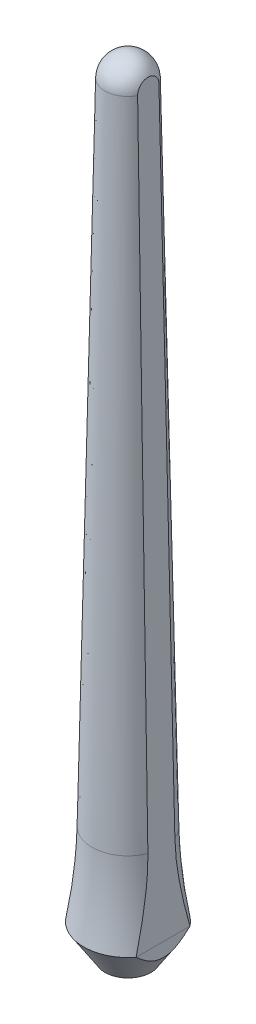
ISO-10303-21;
HEADER;
FILE_DESCRIPTION(('STEP AP214'),'2;1');
FILE_NAME('part.step','',(''),(''),'','','');
FILE_SCHEMA(('AUTOMOTIVE_DESIGN { 1 0 10303 214 1 1 1 1 }'));
ENDSEC;
DATA;
#1=APPLICATION_CONTEXT('core data for automotive mechanical design processes');
#2=APPLICATION_PROTOCOL_DEFINITION('international standard','automotive_design',2000,#1);
#3=PRODUCT_CONTEXT('',#1,'mechanical');
#4=PRODUCT('Part','Part','',(#3));
#5=PRODUCT_RELATED_PRODUCT_CATEGORY('part','',(#4));
#6=PRODUCT_DEFINITION_FORMATION('','',#4);
#7=PRODUCT_DEFINITION_CONTEXT('part definition',#1,'design');
#8=PRODUCT_DEFINITION('design','',#6,#7);
#9=PRODUCT_DEFINITION_SHAPE('','',#8);
#10=(LENGTH_UNIT() NAMED_UNIT(*) SI_UNIT(.MILLI.,.METRE.));
#11=(NAMED_UNIT(*) PLANE_ANGLE_UNIT() SI_UNIT($,.RADIAN.));
#12=(NAMED_UNIT(*) SI_UNIT($,.STERADIAN.) SOLID_ANGLE_UNIT());
#13=UNCERTAINTY_MEASURE_WITH_UNIT(LENGTH_MEASURE(1.E-05),#10,'distance_accuracy_value','');
#14=(GEOMETRIC_REPRESENTATION_CONTEXT(3) GLOBAL_UNCERTAINTY_ASSIGNED_CONTEXT((#13)) GLOBAL_UNIT_ASSIGNED_CONTEXT((#10,
#11,#12)) REPRESENTATION_CONTEXT('',''));
#15=CARTESIAN_POINT('',(0.,0.,0.));
#16=DIRECTION('',(0.,0.,1.));
#17=DIRECTION('',(1.,0.,0.));
#18=AXIS2_PLACEMENT_3D('',#15,#16,#17);
#19=CARTESIAN_POINT('',(0.,5.00000000000002,0.));
#20=DIRECTION('',(0.,-1.,0.));
#21=DIRECTION('',(0.,0.,-1.));
#22=AXIS2_PLACEMENT_3D('',#19,#20,#21);
#23=PLANE('',#22);
#24=CARTESIAN_POINT('',(0.,5.00000000000002,0.));
#25=DIRECTION('',(0.,-1.,0.));
#26=DIRECTION('',(0.,0.,-1.));
#27=AXIS2_PLACEMENT_3D('',#24,#25,#26);
#28=CIRCLE('',#27,2.2);
#29=CARTESIAN_POINT('',(0.,5.00000000000002,-2.2));
#30=VERTEX_POINT('',#29);
#31=EDGE_CURVE('E89',#30,#30,#28,.F.);
#32=ORIENTED_EDGE('',*,*,#31,.T.);
#33=EDGE_LOOP('',(#32));
#34=FACE_BOUND('',#33,.T.);
#35=DIRECTION('',(0.,0.,1.));
#36=VECTOR('',#35,1.);
#37=CARTESIAN_POINT('',(5.35367568229556,5.00000000000003,-10.));
#38=LINE('',#37,#36);
#39=CARTESIAN_POINT('',(5.35367568229556,5.00000000000002,-4.11104082791655));
#40=VERTEX_POINT('',#39);
#41=CARTESIAN_POINT('',(5.35367568229556,5.00000000000002,4.11104082791656));
#42=VERTEX_POINT('',#41);
#43=EDGE_CURVE('E88',#40,#42,#38,.T.);
#44=ORIENTED_EDGE('',*,*,#43,.T.);
#45=CARTESIAN_POINT('',(0.,5.00000000000002,0.));
#46=DIRECTION('',(0.,1.,0.));
#47=DIRECTION('',(0.,0.,1.));
#48=AXIS2_PLACEMENT_3D('',#45,#46,#47);
#49=CIRCLE('',#48,6.74999999999998);
#50=EDGE_CURVE('E59',#40,#42,#49,.T.);
#51=ORIENTED_EDGE('',*,*,#50,.F.);
#52=EDGE_LOOP('',(#44,#51));
#53=FACE_BOUND('',#52,.T.);
#54=ADVANCED_FACE('F45',(#34,#53),#23,.T.);
#55=CARTESIAN_POINT('',(0.,116.499285975242,0.));
#56=DIRECTION('',(0.,1.,0.));
#57=DIRECTION('',(1.,0.,0.));
#58=AXIS2_PLACEMENT_3D('',#55,#56,#57);
#59=SPHERICAL_SURFACE('',#58,3.5007140247583);
#60=CARTESIAN_POINT('',(0.,116.569987341137,0.));
#61=DIRECTION('',(0.,1.,0.));
#62=DIRECTION('',(0.,0.,1.));
#63=AXIS2_PLACEMENT_3D('',#60,#61,#62);
#64=CIRCLE('',#63,3.5);
#65=CARTESIAN_POINT('',(3.09991839717048,116.569987341137,-1.62496336293592));
#66=VERTEX_POINT('',#65);
#67=CARTESIAN_POINT('',(3.09991839717048,116.569987341137,1.62496336293592));
#68=VERTEX_POINT('',#67);
#69=EDGE_CURVE('E145',#66,#68,#64,.T.);
#70=ORIENTED_EDGE('',*,*,#69,.T.);
#71=CARTESIAN_POINT('',(3.10008158618536,116.561908833107,0.));
#72=DIRECTION('',(-0.999796034536597,-0.0201962700738357,0.));
#73=DIRECTION('',(0.0201962700738357,-0.999796034536597,0.));
#74=AXIS2_PLACEMENT_3D('',#71,#72,#73);
#75=CIRCLE('',#74,1.62498345216394);
#76=EDGE_CURVE('E85',#68,#66,#75,.T.);
#77=ORIENTED_EDGE('',*,*,#76,.T.);
#78=EDGE_LOOP('',(#70,#77));
#79=FACE_BOUND('',#78,.T.);
#80=ADVANCED_FACE('F132',(#79),#59,.T.);
#81=CARTESIAN_POINT('',(0.,17.5619991451545,0.));
#82=DIRECTION('',(0.,-1.,0.));
#83=DIRECTION('',(0.,0.,-1.));
#84=AXIS2_PLACEMENT_3D('',#81,#82,#83);
#85=CONICAL_SURFACE('',#84,5.5,0.0201976432997341);
#86=ORIENTED_EDGE('',*,*,#69,.F.);
#87=CARTESIAN_POINT('',(3.09991435709243,116.570187341137,-1.62496236822955));
#88=CARTESIAN_POINT('',(3.14610546242772,114.283543135239,-1.63633393036813));
#89=CARTESIAN_POINT('',(3.19229657957681,111.996898344511,-1.6475877493091));
#90=CARTESIAN_POINT('',(3.42325222342207,100.563671514697,-1.70329716735332));
#91=CARTESIAN_POINT('',(3.60801691597004,91.4170812652855,-1.74607373438255));
#92=CARTESIAN_POINT('',(4.0106382231318,71.4857184518239,-1.83619547812997));
#93=CARTESIAN_POINT('',(4.22849488788081,60.700943405881,-1.88298674040131));
#94=CARTESIAN_POINT('',(4.66420848322755,39.1313801534215,-1.9733702488432));
#95=CARTESIAN_POINT('',(4.88206541382528,28.3465919469052,-2.01696249509556));
#96=CARTESIAN_POINT('',(5.09992243724853,17.5617991451546,-2.05932891372988));
#97=B_SPLINE_CURVE_WITH_KNOTS('',3,(#87,#88,#89,#90,#91,#92,#93,#94,#95,#96),.UNSPECIFIED.,.F.,
.F.,(4,2,2,2,4),(0.,6.86141690018943,34.3070849192268,66.6683145201144,99.0295432934016),.UNSPECIFIED.);
#98=CARTESIAN_POINT('',(5.09991839717052,17.5619991451525,-2.05932812883293));
#99=VERTEX_POINT('',#98);
#100=EDGE_CURVE('E117',#66,#99,#97,.T.);
#101=ORIENTED_EDGE('',*,*,#100,.T.);
#102=CARTESIAN_POINT('',(0.,17.5619991451545,0.));
#103=DIRECTION('',(0.,1.,0.));
#104=DIRECTION('',(0.,0.,1.));
#105=AXIS2_PLACEMENT_3D('',#102,#103,#104);
#106=CIRCLE('',#105,5.5);
#107=CARTESIAN_POINT('',(5.09991839717048,17.5619991451545,2.05932812883278));
#108=VERTEX_POINT('',#107);
#109=EDGE_CURVE('E86',#99,#108,#106,.T.);
#110=ORIENTED_EDGE('',*,*,#109,.T.);
#111=CARTESIAN_POINT('',(5.09992243724853,17.5617991451545,2.05932891372988));
#112=CARTESIAN_POINT('',(5.0273359396284,21.1551206949352,2.04522414430223));
#113=CARTESIAN_POINT('',(4.95474945274636,24.7484417131377,2.03097838742701));
#114=CARTESIAN_POINT('',(4.59181707437437,42.7150440300346,1.95898343876524));
#115=CARTESIAN_POINT('',(4.30147136568499,57.0883162793709,1.89893575695234));
#116=CARTESIAN_POINT('',(3.85925716155159,78.9796856308383,1.80255164707141));
#117=CARTESIAN_POINT('',(3.70738845712159,86.4977930786105,1.76856544396031));
#118=CARTESIAN_POINT('',(3.4036512465835,101.533998156429,1.69845717388399));
#119=CARTESIAN_POINT('',(3.25178274047541,109.052095786474,1.66233510687496));
#120=CARTESIAN_POINT('',(3.09991435709243,116.570187341137,1.62496236822955));
#121=B_SPLINE_CURVE_WITH_KNOTS('',3,(#111,#112,#113,#114,#115,#116,#117,#118,#119,#120),
.UNSPECIFIED.,.F.,.F.,(4,2,2,2,4),(0.,10.7822469186976,53.9112353206532,76.4703890501444,
99.0295432424881),.UNSPECIFIED.);
#122=EDGE_CURVE('E67',#108,#68,#121,.T.);
#123=ORIENTED_EDGE('',*,*,#122,.T.);
#124=EDGE_LOOP('',(#86,#101,#110,#123));
#125=FACE_BOUND('',#124,.T.);
#126=ADVANCED_FACE('F128',(#125),#85,.T.);
#127=CARTESIAN_POINT('',(0.,19.1777007510614,0.));
#128=DIRECTION('',(0.,1.,0.));
#129=DIRECTION('',(0.,0.,1.));
#130=AXIS2_PLACEMENT_3D('',#127,#128,#129);
#131=TOROIDAL_SURFACE('',#130,85.4836827629278,80.);
#132=ORIENTED_EDGE('',*,*,#109,.F.);
#133=CARTESIAN_POINT('',(5.09991435709243,17.5621991451545,-2.05932734460359));
#134=CARTESIAN_POINT('',(5.10452896629076,17.3337575586357,-2.06020698915133));
#135=CARTESIAN_POINT('',(5.10914319828198,17.1053346453757,-2.06373293590793));
#136=CARTESIAN_POINT('',(5.1183686047149,16.6486401797689,-2.07596787817014));
#137=CARTESIAN_POINT('',(5.12297977931522,16.4203686195699,-2.08467657960226));
#138=CARTESIAN_POINT('',(5.13680021706112,15.736201750965,-2.1183988822322));
#139=CARTESIAN_POINT('',(5.14600223754393,15.2806649832946,-2.1510100753998));
#140=CARTESIAN_POINT('',(5.16435190555463,14.3722831263924,-2.23428560069819));
#141=CARTESIAN_POINT('',(5.17349962746221,13.9194343550698,-2.28491095042669));
#142=CARTESIAN_POINT('',(5.19175606191117,13.0156679318581,-2.40150902285611));
#143=CARTESIAN_POINT('',(5.20086476791155,12.5647506037749,-2.46748422371461));
#144=CARTESIAN_POINT('',(5.21899607631099,11.6671784197801,-2.61183471041757));
#145=CARTESIAN_POINT('',(5.22801888201827,11.2205134992999,-2.69014811399502));
#146=CARTESIAN_POINT('',(5.24602403975343,10.3291862770449,-2.85729260397339));
#147=CARTESIAN_POINT('',(5.25500639326848,9.8845239016496,-2.94612330039143));
#148=CARTESIAN_POINT('',(5.27293689162516,8.99689261682651,-3.13274433737403));
#149=CARTESIAN_POINT('',(5.28188502006178,8.55392451951234,-3.2305385214563));
#150=CARTESIAN_POINT('',(5.29974517507242,7.66977551127606,-3.43389413009461));
#151=CARTESIAN_POINT('',(5.30865720153345,7.22859460594814,-3.5394555789435));
#152=CARTESIAN_POINT('',(5.32056926750203,6.63889976254498,-3.68548769992811));
#153=CARTESIAN_POINT('',(5.32358482232377,6.48961775444731,-3.72288094197163));
#154=CARTESIAN_POINT('',(5.32961157812885,6.19126927064266,-3.79844108564974));
#155=CARTESIAN_POINT('',(5.33262277961424,6.0422027700816,-3.83660788891452));
#156=CARTESIAN_POINT('',(5.33864371058579,5.74414263880186,-3.91372895820277));
#157=CARTESIAN_POINT('',(5.34165343681504,5.59514916931262,-3.95268384711777));
#158=CARTESIAN_POINT('',(5.34766933650974,5.29733810633174,-4.03133725860596));
#159=CARTESIAN_POINT('',(5.3506755094701,5.1485205378449,-4.07103587590277));
#160=CARTESIAN_POINT('',(5.35367972237361,4.99980000000003,-4.11109469951994));
#161=B_SPLINE_CURVE_WITH_KNOTS('',3,(#133,#134,#135,#136,#137,#138,#139,#140,#141,#142,#143,
#144,#145,#146,#147,#148,#149,#150,#151,#152,#153,#154,#155,#156,#157,#158,#159,#160),
.UNSPECIFIED.,.F.,.F.,(4,2,2,2,2,2,2,2,2,2,2,2,2,4),(0.,0.685438783844462,1.37083867907211,
2.74077127796213,4.10775721095033,5.47496399038895,6.83551990243582,8.19602538064549,
9.55711699356034,10.9182128635994,11.3799824091508,11.8416935977678,12.3037851959859,
12.765936053254),.UNSPECIFIED.);
#162=EDGE_CURVE('E84',#99,#40,#161,.T.);
#163=ORIENTED_EDGE('',*,*,#162,.T.);
#164=ORIENTED_EDGE('',*,*,#50,.T.);
#165=CARTESIAN_POINT('',(5.35367972237361,4.99980000000002,4.1110946995199));
#166=CARTESIAN_POINT('',(5.34480768219585,5.43900142459723,3.99283466106684));
#167=CARTESIAN_POINT('',(5.33591873296906,5.87903991465762,3.87764368570681));
#168=CARTESIAN_POINT('',(5.31810505406893,6.76088816979317,3.65405688658514));
#169=CARTESIAN_POINT('',(5.30918032062148,7.20269812170189,3.54566180076353));
#170=CARTESIAN_POINT('',(5.29126749895949,8.08945433953556,3.33602749218125));
#171=CARTESIAN_POINT('',(5.2822793002837,8.53440607373342,3.23481133044022));
#172=CARTESIAN_POINT('',(5.26426531115392,9.42617048529515,3.04096485297671));
#173=CARTESIAN_POINT('',(5.25523952172136,9.87298311209443,2.94833430553399));
#174=CARTESIAN_POINT('',(5.23724064492169,10.7639994029556,2.77401650097064));
#175=CARTESIAN_POINT('',(5.22826796441692,11.2081829257071,2.69222689012234));
#176=CARTESIAN_POINT('',(5.21028137942427,12.0985907230261,2.54039656869691));
#177=CARTESIAN_POINT('',(5.20126747328878,12.5448150791572,2.47035633198488));
#178=CARTESIAN_POINT('',(5.18321025742967,13.4387193864727,2.34449625335994));
#179=CARTESIAN_POINT('',(5.17416699860283,13.8863968180633,2.28865872969257));
#180=CARTESIAN_POINT('',(5.1560452473302,14.783495886109,2.19375806830287));
#181=CARTESIAN_POINT('',(5.14696676055255,15.2329172419685,2.15469233644614));
#182=CARTESIAN_POINT('',(5.13156251597715,15.9954888745131,2.10469295216028));
#183=CARTESIAN_POINT('',(5.12524328865481,16.3083158665817,2.08881067171678));
#184=CARTESIAN_POINT('',(5.11575413049453,16.7780670961433,2.07225513162622));
#185=CARTESIAN_POINT('',(5.11258668703296,16.9348681985708,2.06794737471449));
#186=CARTESIAN_POINT('',(5.1062509947377,17.2485102725616,2.06178898987371));
#187=CARTESIAN_POINT('',(5.10308274595549,17.4053512415772,2.05993823198454));
#188=CARTESIAN_POINT('',(5.09991435709243,17.5621991451545,2.0593273446036));
#189=B_SPLINE_CURVE_WITH_KNOTS('',3,(#165,#166,#167,#168,#169,#170,#171,#172,#173,#174,#175,
#176,#177,#178,#179,#180,#181,#182,#183,#184,#185,#186,#187,#188),.UNSPECIFIED.,.F.,.F.,(4,2,2,
2,2,2,2,2,2,2,2,4),(0.,1.36479693473999,2.72974181187477,4.09888944252287,5.46800010998594,
6.82308995642522,8.17823444198564,9.53168348224648,10.8849231057195,11.824655186397,
12.2953144474091,12.7659488124545),.UNSPECIFIED.);
#190=EDGE_CURVE('E82',#42,#108,#189,.T.);
#191=ORIENTED_EDGE('',*,*,#190,.T.);
#192=EDGE_LOOP('',(#132,#163,#164,#191));
#193=FACE_BOUND('',#192,.T.);
#194=ADVANCED_FACE('F81',(#193),#131,.F.);
#195=CARTESIAN_POINT('',(2.82862690032118,130.,-10.));
#196=DIRECTION('',(-0.999796034536597,-0.0201962700738357,0.));
#197=DIRECTION('',(0.0201962700738357,-0.999796034536597,0.));
#198=AXIS2_PLACEMENT_3D('',#195,#196,#197);
#199=PLANE('',#198);
#200=ORIENTED_EDGE('',*,*,#43,.F.);
#201=ORIENTED_EDGE('',*,*,#162,.F.);
#202=ORIENTED_EDGE('',*,*,#100,.F.);
#203=ORIENTED_EDGE('',*,*,#76,.F.);
#204=ORIENTED_EDGE('',*,*,#122,.F.);
#205=ORIENTED_EDGE('',*,*,#190,.F.);
#206=EDGE_LOOP('',(#200,#201,#202,#203,#204,#205));
#207=FACE_BOUND('',#206,.T.);
#208=ADVANCED_FACE('F91',(#207),#199,.F.);
#209=CARTESIAN_POINT('',(0.,12.,0.));
#210=DIRECTION('',(0.,-1.,0.));
#211=DIRECTION('',(0.,0.,-1.));
#212=AXIS2_PLACEMENT_3D('',#209,#210,#211);
#213=CYLINDRICAL_SURFACE('',#212,2.2);
#214=CARTESIAN_POINT('',(0.,11.5,0.));
#215=DIRECTION('',(0.,-1.,0.));
#216=DIRECTION('',(0.,0.,-1.));
#217=AXIS2_PLACEMENT_3D('',#214,#215,#216);
#218=CIRCLE('',#217,2.2);
#219=CARTESIAN_POINT('',(0.,11.5,-2.2));
#220=VERTEX_POINT('',#219);
#221=EDGE_CURVE('E12',#220,#220,#218,.F.);
#222=ORIENTED_EDGE('',*,*,#221,.T.);
#223=EDGE_LOOP('',(#222));
#224=FACE_BOUND('',#223,.T.);
#225=ORIENTED_EDGE('',*,*,#31,.F.);
#226=EDGE_LOOP('',(#225));
#227=FACE_BOUND('',#226,.T.);
#228=ADVANCED_FACE('F113',(#224,#227),#213,.F.);
#229=CARTESIAN_POINT('',(0.,12.,0.));
#230=DIRECTION('',(0.,-1.,0.));
#231=DIRECTION('',(0.,0.,-1.));
#232=AXIS2_PLACEMENT_3D('',#229,#230,#231);
#233=PLANE('',#232);
#234=CARTESIAN_POINT('',(0.,12.,0.));
#235=DIRECTION('',(0.,-1.,0.));
#236=DIRECTION('',(0.,0.,-1.));
#237=AXIS2_PLACEMENT_3D('',#234,#235,#236);
#238=CIRCLE('',#237,1.70000000000001);
#239=CARTESIAN_POINT('',(0.,12.,-1.70000000000001));
#240=VERTEX_POINT('',#239);
#241=EDGE_CURVE('E53',#240,#240,#238,.T.);
#242=ORIENTED_EDGE('',*,*,#241,.T.);
#243=EDGE_LOOP('',(#242));
#244=FACE_BOUND('',#243,.T.);
#245=ADVANCED_FACE('F141',(#244),#233,.T.);
#246=CARTESIAN_POINT('',(0.,12.,0.));
#247=DIRECTION('',(0.,-1.,0.));
#248=DIRECTION('',(0.,0.,-1.));
#249=AXIS2_PLACEMENT_3D('',#246,#247,#248);
#250=CONICAL_SURFACE('',#249,1.70000000000001,0.785398163397458);
#251=ORIENTED_EDGE('',*,*,#221,.F.);
#252=EDGE_LOOP('',(#251));
#253=FACE_BOUND('',#252,.T.);
#254=ORIENTED_EDGE('',*,*,#241,.F.);
#255=EDGE_LOOP('',(#254));
#256=FACE_BOUND('',#255,.T.);
#257=ADVANCED_FACE('F47',(#253,#256),#250,.F.);
#258=CLOSED_SHELL('',(#54,#80,#126,#194,#208,#228,#245,#257));
#259=MANIFOLD_SOLID_BREP('B2',#258);
#260=CARTESIAN_POINT('',(0.,5.00000000000002,0.));
#261=DIRECTION('',(0.,-1.,0.));
#262=DIRECTION('',(0.,0.,-1.));
#263=AXIS2_PLACEMENT_3D('',#260,#261,#262);
#264=PLANE('',#263);
#265=DIRECTION('',(0.,0.,1.));
#266=VECTOR('',#265,1.);
#267=CARTESIAN_POINT('',(5.35367568229556,5.00000000000003,-10.));
#268=LINE('',#267,#266);
#269=CARTESIAN_POINT('',(5.35367568229556,5.00000000000002,-4.11104082791655));
#270=VERTEX_POINT('',#269);
#271=CARTESIAN_POINT('',(5.35367568229556,5.00000000000002,4.11104082791656));
#272=VERTEX_POINT('',#271);
#273=EDGE_CURVE('E229',#270,#272,#268,.T.);
#274=ORIENTED_EDGE('',*,*,#273,.F.);
#275=CARTESIAN_POINT('',(0.,5.00000000000002,0.));
#276=DIRECTION('',(0.,1.,0.));
#277=DIRECTION('',(0.,0.,1.));
#278=AXIS2_PLACEMENT_3D('',#275,#276,#277);
#279=CIRCLE('',#278,6.74999999999998);
#280=EDGE_CURVE('E43',#270,#272,#279,.T.);
#281=ORIENTED_EDGE('',*,*,#280,.T.);
#282=EDGE_LOOP('',(#274,#281));
#283=FACE_BOUND('',#282,.T.);
#284=CARTESIAN_POINT('',(0.,5.00000000000002,0.));
#285=DIRECTION('',(0.,-1.,0.));
#286=DIRECTION('',(0.,0.,-1.));
#287=AXIS2_PLACEMENT_3D('',#284,#285,#286);
#288=CIRCLE('',#287,2.2);
#289=CARTESIAN_POINT('',(0.,5.00000000000002,-2.2));
#290=VERTEX_POINT('',#289);
#291=EDGE_CURVE('E215',#290,#290,#288,.F.);
#292=ORIENTED_EDGE('',*,*,#291,.F.);
#293=EDGE_LOOP('',(#292));
#294=FACE_BOUND('',#293,.T.);
#295=ADVANCED_FACE('F212',(#283,#294),#264,.F.);
#296=CARTESIAN_POINT('',(3.5,0.,0.));
#297=DIRECTION('',(0.,1.,0.));
#298=DIRECTION('',(0.,0.,1.));
#299=AXIS2_PLACEMENT_3D('',#296,#297,#298);
#300=PLANE('',#299);
#301=CARTESIAN_POINT('',(0.,0.,0.));
#302=DIRECTION('',(0.,1.,0.));
#303=DIRECTION('',(0.,0.,1.));
#304=AXIS2_PLACEMENT_3D('',#301,#302,#303);
#305=CIRCLE('',#304,2.40000000000004);
#306=CARTESIAN_POINT('',(0.,0.,2.40000000000004));
#307=VERTEX_POINT('',#306);
#308=EDGE_CURVE('E234',#307,#307,#305,.T.);
#309=ORIENTED_EDGE('',*,*,#308,.T.);
#310=EDGE_LOOP('',(#309));
#311=FACE_BOUND('',#310,.T.);
#312=CARTESIAN_POINT('',(0.,0.,0.));
#313=DIRECTION('',(0.,1.,0.));
#314=DIRECTION('',(0.,0.,1.));
#315=AXIS2_PLACEMENT_3D('',#312,#313,#314);
#316=CIRCLE('',#315,3.5);
#317=CARTESIAN_POINT('',(0.,0.,3.5));
#318=VERTEX_POINT('',#317);
#319=EDGE_CURVE('E238',#318,#318,#316,.T.);
#320=ORIENTED_EDGE('',*,*,#319,.F.);
#321=EDGE_LOOP('',(#320));
#322=FACE_BOUND('',#321,.T.);
#323=ADVANCED_FACE('F267',(#311,#322),#300,.F.);
#324=CARTESIAN_POINT('',(0.,0.,0.));
#325=DIRECTION('',(0.,1.,0.));
#326=DIRECTION('',(0.,0.,1.));
#327=AXIS2_PLACEMENT_3D('',#324,#325,#326);
#328=CONICAL_SURFACE('',#327,3.5,0.576375220591178);
#329=ORIENTED_EDGE('',*,*,#280,.F.);
#330=CARTESIAN_POINT('',(5.35367164221751,5.00020000000003,-4.11125953501063));
#331=CARTESIAN_POINT('',(5.35511692423103,4.92865276773287,-4.03301479306865));
#332=CARTESIAN_POINT('',(5.35654779961362,4.8578187212381,-3.95411897956354));
#333=CARTESIAN_POINT('',(5.35937664825315,4.7177794148828,-3.7948686918183));
#334=CARTESIAN_POINT('',(5.36077461517961,4.64857446840616,-3.71451394210966));
#335=CARTESIAN_POINT('',(5.36492255015165,4.44323512003153,-3.47046241528216));
#336=CARTESIAN_POINT('',(5.36761563461441,4.30991668268151,-3.30436365374862));
#337=CARTESIAN_POINT('',(5.37287192877134,4.04970912775949,-2.95984040312821));
#338=CARTESIAN_POINT('',(5.37542945411824,3.92310140808097,-2.78120170956469));
#339=CARTESIAN_POINT('',(5.38024974466432,3.68447777333756,-2.41462674941403));
#340=CARTESIAN_POINT('',(5.38251297976906,3.57243859607004,-2.22670598289944));
#341=CARTESIAN_POINT('',(5.38569532706075,3.41489969452454,-1.9284168119956));
#342=CARTESIAN_POINT('',(5.38675670809534,3.3623570940522,-1.82176564613117));
#343=CARTESIAN_POINT('',(5.38873750908259,3.26429953367015,-1.60523944894286));
#344=CARTESIAN_POINT('',(5.38965692042145,3.21878500017788,-1.49536422248486));
#345=CARTESIAN_POINT('',(5.39132311012174,3.13630195508868,-1.27326793542692));
#346=CARTESIAN_POINT('',(5.39207101239074,3.09927780557818,-1.16106772796145));
#347=CARTESIAN_POINT('',(5.39337675164893,3.0346384970468,-0.933994915400003));
#348=CARTESIAN_POINT('',(5.39393464511277,3.00702054230585,-0.819123115220893));
#349=CARTESIAN_POINT('',(5.3948451788186,2.9619454871063,-0.585472377297035));
#350=CARTESIAN_POINT('',(5.39519440203568,2.94465754302941,-0.466660342963415));
#351=CARTESIAN_POINT('',(5.39565662828406,2.92177549755743,-0.227909800306506));
#352=CARTESIAN_POINT('',(5.39576965060529,2.91618044123434,-0.107971384775526));
#353=CARTESIAN_POINT('',(5.39575363982904,2.91697303860713,0.131874023397841));
#354=CARTESIAN_POINT('',(5.39562459078746,2.92336148160024,0.251781013450118));
#355=CARTESIAN_POINT('',(5.39513111754964,2.94779037785241,0.49039644031121));
#356=CARTESIAN_POINT('',(5.39476666510787,2.96583222937898,0.609104731554516));
#357=CARTESIAN_POINT('',(5.39377312108013,3.01501662706443,0.855929306449793));
#358=CARTESIAN_POINT('',(5.39312151481753,3.04727373964209,0.983821718109006));
#359=CARTESIAN_POINT('',(5.39158717285173,3.1232297952616,1.23617294938953));
#360=CARTESIAN_POINT('',(5.390704329783,3.16693405332554,1.36063014425583));
#361=CARTESIAN_POINT('',(5.38873503926084,3.26442179971148,1.60662684087154));
#362=CARTESIAN_POINT('',(5.38764704125782,3.31828204643188,1.72813559823649));
#363=CARTESIAN_POINT('',(5.38530594647016,3.43417558898288,1.96713502070341));
#364=CARTESIAN_POINT('',(5.38405286148488,3.49620830069847,2.08462597221697));
#365=CARTESIAN_POINT('',(5.38071758169192,3.66131797188456,2.37644679977846));
#366=CARTESIAN_POINT('',(5.37854537377503,3.76885093978185,2.54824898215406));
#367=CARTESIAN_POINT('',(5.37396576318337,3.99555995548238,2.88410876999277));
#368=CARTESIAN_POINT('',(5.37155811957569,4.11474793042681,3.04815818163453));
#369=CARTESIAN_POINT('',(5.36663520556251,4.35845183668058,3.36516955677594));
#370=CARTESIAN_POINT('',(5.36412463643611,4.48273503589631,3.51831166090924));
#371=CARTESIAN_POINT('',(5.36026655123287,4.67372566302697,3.74377788107529));
#372=CARTESIAN_POINT('',(5.35896688509255,4.73806432796687,3.81813235761211));
#373=CARTESIAN_POINT('',(5.35633949165318,4.86813079728223,3.96559785143201));
#374=CARTESIAN_POINT('',(5.35501176835379,4.93385840365894,4.03870904330379));
#375=CARTESIAN_POINT('',(5.35367164221751,5.00020000000002,4.11125953501062));
#376=B_SPLINE_CURVE_WITH_KNOTS('',3,(#330,#331,#332,#333,#334,#335,#336,#337,#338,#339,#340,
#341,#342,#343,#344,#345,#346,#347,#348,#349,#350,#351,#352,#353,#354,#355,#356,#357,#358,#359,
#360,#361,#362,#363,#364,#365,#366,#367,#368,#369,#370,#371,#372,#373,#374,#375),.UNSPECIFIED.,
.F.,.F.,(4,2,2,2,2,2,2,2,2,2,2,2,2,2,2,2,2,2,2,2,2,2,4),(0.,0.318094523005165,0.636249744729262,
1.27494844693423,1.93138584890341,2.58676187053905,2.943247155499,3.2997540611783,
3.65385337560378,4.00784735218734,4.3674896062327,4.72710248807435,5.08673905677158,
5.44641878550784,5.84149662563462,6.23675823047004,6.63513651104889,7.03348633355318,
7.64087807518887,8.24889802826971,8.8403988057229,9.135389781723,9.43033898562389),.UNSPECIFIED.);
#377=EDGE_CURVE('E233',#270,#272,#376,.T.);
#378=ORIENTED_EDGE('',*,*,#377,.T.);
#379=EDGE_LOOP('',(#329,#378));
#380=FACE_BOUND('',#379,.T.);
#381=ORIENTED_EDGE('',*,*,#319,.T.);
#382=EDGE_LOOP('',(#381));
#383=FACE_BOUND('',#382,.T.);
#384=ADVANCED_FACE('F235',(#380,#383),#328,.T.);
#385=CARTESIAN_POINT('',(2.82862690032118,130.,-10.));
#386=DIRECTION('',(-0.999796034536597,-0.0201962700738357,0.));
#387=DIRECTION('',(0.0201962700738357,-0.999796034536597,0.));
#388=AXIS2_PLACEMENT_3D('',#385,#386,#387);
#389=PLANE('',#388);
#390=ORIENTED_EDGE('',*,*,#377,.F.);
#391=ORIENTED_EDGE('',*,*,#273,.T.);
#392=EDGE_LOOP('',(#390,#391));
#393=FACE_BOUND('',#392,.T.);
#394=ADVANCED_FACE('F232',(#393),#389,.F.);
#395=CARTESIAN_POINT('',(0.,0.746410161513902,0.));
#396=DIRECTION('',(0.,-1.,0.));
#397=DIRECTION('',(0.,0.,-1.));
#398=AXIS2_PLACEMENT_3D('',#395,#396,#397);
#399=CONICAL_SURFACE('',#398,2.2,0.261799387799158);
#400=ORIENTED_EDGE('',*,*,#308,.F.);
#401=EDGE_LOOP('',(#400));
#402=FACE_BOUND('',#401,.T.);
#403=CARTESIAN_POINT('',(0.,0.746410161513902,0.));
#404=DIRECTION('',(0.,1.,0.));
#405=DIRECTION('',(0.,0.,1.));
#406=AXIS2_PLACEMENT_3D('',#403,#404,#405);
#407=CIRCLE('',#406,2.2);
#408=CARTESIAN_POINT('',(0.,0.746410161513902,2.2));
#409=VERTEX_POINT('',#408);
#410=EDGE_CURVE('E237',#409,#409,#407,.F.);
#411=ORIENTED_EDGE('',*,*,#410,.F.);
#412=EDGE_LOOP('',(#411));
#413=FACE_BOUND('',#412,.T.);
#414=ADVANCED_FACE('F256',(#402,#413),#399,.F.);
#415=CARTESIAN_POINT('',(0.,12.,0.));
#416=DIRECTION('',(0.,-1.,0.));
#417=DIRECTION('',(0.,0.,-1.));
#418=AXIS2_PLACEMENT_3D('',#415,#416,#417);
#419=CYLINDRICAL_SURFACE('',#418,2.2);
#420=ORIENTED_EDGE('',*,*,#291,.T.);
#421=EDGE_LOOP('',(#420));
#422=FACE_BOUND('',#421,.T.);
#423=ORIENTED_EDGE('',*,*,#410,.T.);
#424=EDGE_LOOP('',(#423));
#425=FACE_BOUND('',#424,.T.);
#426=ADVANCED_FACE('F257',(#422,#425),#419,.F.);
#427=CLOSED_SHELL('',(#295,#323,#384,#394,#414,#426));
#428=MANIFOLD_SOLID_BREP('B6',#427);
#429=ADVANCED_BREP_SHAPE_REPRESENTATION('',(#18,#259,#428),#14);
#430=SHAPE_DEFINITION_REPRESENTATION(#9,#429);
ENDSEC;
END-ISO-10303-21;
